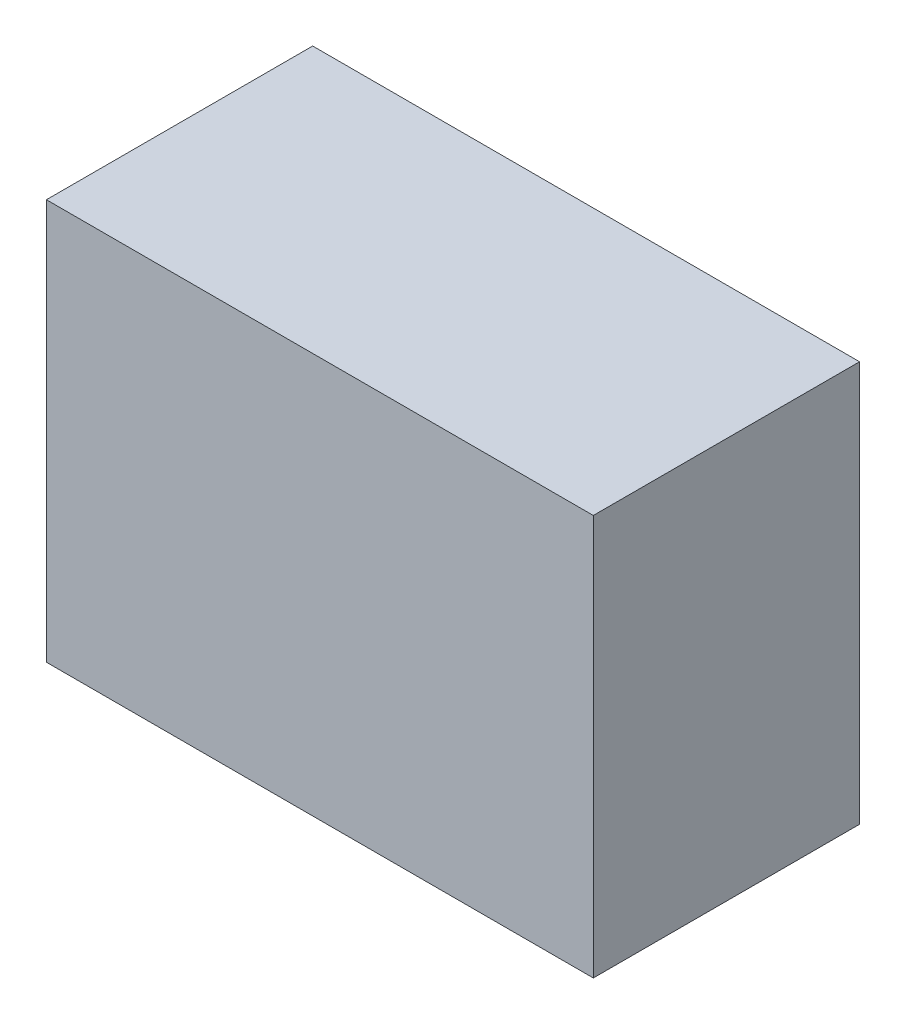
ISO-10303-21;
HEADER;
FILE_DESCRIPTION(('STEP AP214'),'2;1');
FILE_NAME('part.step','',(''),(''),'','','');
FILE_SCHEMA(('AUTOMOTIVE_DESIGN { 1 0 10303 214 1 1 1 1 }'));
ENDSEC;
DATA;
#1=APPLICATION_CONTEXT('core data for automotive mechanical design processes');
#2=APPLICATION_PROTOCOL_DEFINITION('international standard','automotive_design',2000,#1);
#3=PRODUCT_CONTEXT('',#1,'mechanical');
#4=PRODUCT('Part','Part','',(#3));
#5=PRODUCT_RELATED_PRODUCT_CATEGORY('part','',(#4));
#6=PRODUCT_DEFINITION_FORMATION('','',#4);
#7=PRODUCT_DEFINITION_CONTEXT('part definition',#1,'design');
#8=PRODUCT_DEFINITION('design','',#6,#7);
#9=PRODUCT_DEFINITION_SHAPE('','',#8);
#10=(LENGTH_UNIT() NAMED_UNIT(*) SI_UNIT(.MILLI.,.METRE.));
#11=(NAMED_UNIT(*) PLANE_ANGLE_UNIT() SI_UNIT($,.RADIAN.));
#12=(NAMED_UNIT(*) SI_UNIT($,.STERADIAN.) SOLID_ANGLE_UNIT());
#13=UNCERTAINTY_MEASURE_WITH_UNIT(LENGTH_MEASURE(1.E-05),#10,'distance_accuracy_value','');
#14=(GEOMETRIC_REPRESENTATION_CONTEXT(3) GLOBAL_UNCERTAINTY_ASSIGNED_CONTEXT((#13)) GLOBAL_UNIT_ASSIGNED_CONTEXT((#10,
#11,#12)) REPRESENTATION_CONTEXT('',''));
#15=CARTESIAN_POINT('',(0.,0.,0.));
#16=DIRECTION('',(0.,0.,1.));
#17=DIRECTION('',(1.,0.,0.));
#18=AXIS2_PLACEMENT_3D('',#15,#16,#17);
#19=CARTESIAN_POINT('',(0.,0.,22.2));
#20=DIRECTION('',(1.,0.,0.));
#21=DIRECTION('',(0.,0.,-1.));
#22=AXIS2_PLACEMENT_3D('',#19,#20,#21);
#23=PLANE('',#22);
#24=DIRECTION('',(0.,-1.,0.));
#25=VECTOR('',#24,1.);
#26=CARTESIAN_POINT('',(0.,0.,0.));
#27=LINE('',#26,#25);
#28=CARTESIAN_POINT('',(0.,33.4,0.));
#29=VERTEX_POINT('',#28);
#30=CARTESIAN_POINT('',(0.,0.,0.));
#31=VERTEX_POINT('',#30);
#32=EDGE_CURVE('E107',#29,#31,#27,.T.);
#33=ORIENTED_EDGE('',*,*,#32,.T.);
#34=DIRECTION('',(0.,0.,-1.));
#35=VECTOR('',#34,1.);
#36=CARTESIAN_POINT('',(0.,0.,22.2));
#37=LINE('',#36,#35);
#38=CARTESIAN_POINT('',(0.,0.,22.2));
#39=VERTEX_POINT('',#38);
#40=EDGE_CURVE('E11',#39,#31,#37,.T.);
#41=ORIENTED_EDGE('',*,*,#40,.F.);
#42=DIRECTION('',(0.,-1.,0.));
#43=VECTOR('',#42,1.);
#44=CARTESIAN_POINT('',(0.,0.,22.2));
#45=LINE('',#44,#43);
#46=CARTESIAN_POINT('',(0.,33.4,22.2));
#47=VERTEX_POINT('',#46);
#48=EDGE_CURVE('E91',#47,#39,#45,.T.);
#49=ORIENTED_EDGE('',*,*,#48,.F.);
#50=DIRECTION('',(0.,0.,-1.));
#51=VECTOR('',#50,1.);
#52=CARTESIAN_POINT('',(0.,33.4,22.2));
#53=LINE('',#52,#51);
#54=EDGE_CURVE('E103',#47,#29,#53,.T.);
#55=ORIENTED_EDGE('',*,*,#54,.T.);
#56=EDGE_LOOP('',(#33,#41,#49,#55));
#57=FACE_BOUND('',#56,.T.);
#58=ADVANCED_FACE('F39',(#57),#23,.F.);
#59=CARTESIAN_POINT('',(0.,0.,22.2));
#60=DIRECTION('',(0.,1.,0.));
#61=DIRECTION('',(0.,0.,1.));
#62=AXIS2_PLACEMENT_3D('',#59,#60,#61);
#63=PLANE('',#62);
#64=DIRECTION('',(1.,0.,0.));
#65=VECTOR('',#64,1.);
#66=CARTESIAN_POINT('',(0.,0.,0.));
#67=LINE('',#66,#65);
#68=CARTESIAN_POINT('',(45.6,0.,0.));
#69=VERTEX_POINT('',#68);
#70=EDGE_CURVE('E96',#31,#69,#67,.T.);
#71=ORIENTED_EDGE('',*,*,#70,.T.);
#72=DIRECTION('',(0.,0.,-1.));
#73=VECTOR('',#72,1.);
#74=CARTESIAN_POINT('',(45.6,0.,22.2));
#75=LINE('',#74,#73);
#76=CARTESIAN_POINT('',(45.6,0.,22.2));
#77=VERTEX_POINT('',#76);
#78=EDGE_CURVE('E48',#77,#69,#75,.T.);
#79=ORIENTED_EDGE('',*,*,#78,.F.);
#80=DIRECTION('',(1.,0.,0.));
#81=VECTOR('',#80,1.);
#82=CARTESIAN_POINT('',(0.,0.,22.2));
#83=LINE('',#82,#81);
#84=EDGE_CURVE('E86',#39,#77,#83,.T.);
#85=ORIENTED_EDGE('',*,*,#84,.F.);
#86=ORIENTED_EDGE('',*,*,#40,.T.);
#87=EDGE_LOOP('',(#71,#79,#85,#86));
#88=FACE_BOUND('',#87,.T.);
#89=ADVANCED_FACE('F95',(#88),#63,.F.);
#90=CARTESIAN_POINT('',(45.6,0.,22.2));
#91=DIRECTION('',(-1.,0.,0.));
#92=DIRECTION('',(0.,0.,1.));
#93=AXIS2_PLACEMENT_3D('',#90,#91,#92);
#94=PLANE('',#93);
#95=DIRECTION('',(0.,1.,0.));
#96=VECTOR('',#95,1.);
#97=CARTESIAN_POINT('',(45.6,0.,0.));
#98=LINE('',#97,#96);
#99=CARTESIAN_POINT('',(45.6,33.4,0.));
#100=VERTEX_POINT('',#99);
#101=EDGE_CURVE('E73',#69,#100,#98,.T.);
#102=ORIENTED_EDGE('',*,*,#101,.T.);
#103=DIRECTION('',(0.,0.,-1.));
#104=VECTOR('',#103,1.);
#105=CARTESIAN_POINT('',(45.6,33.4,22.2));
#106=LINE('',#105,#104);
#107=CARTESIAN_POINT('',(45.6,33.4,22.2));
#108=VERTEX_POINT('',#107);
#109=EDGE_CURVE('E98',#108,#100,#106,.T.);
#110=ORIENTED_EDGE('',*,*,#109,.F.);
#111=DIRECTION('',(0.,1.,0.));
#112=VECTOR('',#111,1.);
#113=CARTESIAN_POINT('',(45.6,0.,22.2));
#114=LINE('',#113,#112);
#115=EDGE_CURVE('E89',#77,#108,#114,.T.);
#116=ORIENTED_EDGE('',*,*,#115,.F.);
#117=ORIENTED_EDGE('',*,*,#78,.T.);
#118=EDGE_LOOP('',(#102,#110,#116,#117));
#119=FACE_BOUND('',#118,.T.);
#120=ADVANCED_FACE('F99',(#119),#94,.F.);
#121=CARTESIAN_POINT('',(0.,33.4,22.2));
#122=DIRECTION('',(0.,-1.,0.));
#123=DIRECTION('',(0.,0.,-1.));
#124=AXIS2_PLACEMENT_3D('',#121,#122,#123);
#125=PLANE('',#124);
#126=DIRECTION('',(-1.,0.,0.));
#127=VECTOR('',#126,1.);
#128=CARTESIAN_POINT('',(0.,33.4,0.));
#129=LINE('',#128,#127);
#130=EDGE_CURVE('E79',#100,#29,#129,.T.);
#131=ORIENTED_EDGE('',*,*,#130,.T.);
#132=ORIENTED_EDGE('',*,*,#54,.F.);
#133=DIRECTION('',(-1.,0.,0.));
#134=VECTOR('',#133,1.);
#135=CARTESIAN_POINT('',(0.,33.4,22.2));
#136=LINE('',#135,#134);
#137=EDGE_CURVE('E56',#108,#47,#136,.T.);
#138=ORIENTED_EDGE('',*,*,#137,.F.);
#139=ORIENTED_EDGE('',*,*,#109,.T.);
#140=EDGE_LOOP('',(#131,#132,#138,#139));
#141=FACE_BOUND('',#140,.T.);
#142=ADVANCED_FACE('F120',(#141),#125,.F.);
#143=CARTESIAN_POINT('',(0.,0.,22.2));
#144=DIRECTION('',(0.,0.,-1.));
#145=DIRECTION('',(-1.,0.,0.));
#146=AXIS2_PLACEMENT_3D('',#143,#144,#145);
#147=PLANE('',#146);
#148=ORIENTED_EDGE('',*,*,#48,.T.);
#149=ORIENTED_EDGE('',*,*,#84,.T.);
#150=ORIENTED_EDGE('',*,*,#115,.T.);
#151=ORIENTED_EDGE('',*,*,#137,.T.);
#152=EDGE_LOOP('',(#148,#149,#150,#151));
#153=FACE_BOUND('',#152,.T.);
#154=ADVANCED_FACE('F87',(#153),#147,.F.);
#155=CARTESIAN_POINT('',(0.,0.,0.));
#156=DIRECTION('',(0.,0.,-1.));
#157=DIRECTION('',(-1.,0.,0.));
#158=AXIS2_PLACEMENT_3D('',#155,#156,#157);
#159=PLANE('',#158);
#160=ORIENTED_EDGE('',*,*,#32,.F.);
#161=ORIENTED_EDGE('',*,*,#130,.F.);
#162=ORIENTED_EDGE('',*,*,#101,.F.);
#163=ORIENTED_EDGE('',*,*,#70,.F.);
#164=EDGE_LOOP('',(#160,#161,#162,#163));
#165=FACE_BOUND('',#164,.T.);
#166=ADVANCED_FACE('F123',(#165),#159,.T.);
#167=CLOSED_SHELL('',(#58,#89,#120,#142,#154,#166));
#168=MANIFOLD_SOLID_BREP('B2',#167);
#169=ADVANCED_BREP_SHAPE_REPRESENTATION('',(#18,#168),#14);
#170=SHAPE_DEFINITION_REPRESENTATION(#9,#169);
ENDSEC;
END-ISO-10303-21;
